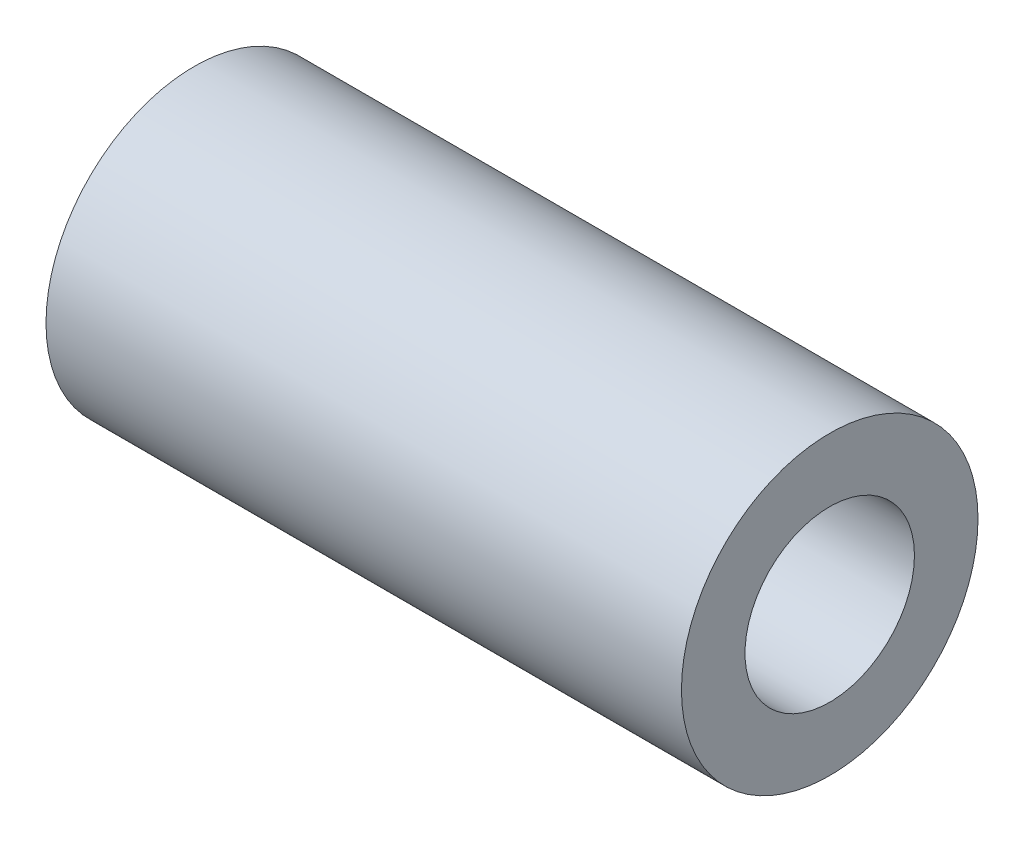
ISO-10303-21;
HEADER;
FILE_DESCRIPTION(('STEP AP214'),'2;1');
FILE_NAME('part.step','',(''),(''),'','','');
FILE_SCHEMA(('AUTOMOTIVE_DESIGN { 1 0 10303 214 1 1 1 1 }'));
ENDSEC;
DATA;
#1=APPLICATION_CONTEXT('core data for automotive mechanical design processes');
#2=APPLICATION_PROTOCOL_DEFINITION('international standard','automotive_design',2000,#1);
#3=PRODUCT_CONTEXT('',#1,'mechanical');
#4=PRODUCT('Part','Part','',(#3));
#5=PRODUCT_RELATED_PRODUCT_CATEGORY('part','',(#4));
#6=PRODUCT_DEFINITION_FORMATION('','',#4);
#7=PRODUCT_DEFINITION_CONTEXT('part definition',#1,'design');
#8=PRODUCT_DEFINITION('design','',#6,#7);
#9=PRODUCT_DEFINITION_SHAPE('','',#8);
#10=(LENGTH_UNIT() NAMED_UNIT(*) SI_UNIT(.MILLI.,.METRE.));
#11=(NAMED_UNIT(*) PLANE_ANGLE_UNIT() SI_UNIT($,.RADIAN.));
#12=(NAMED_UNIT(*) SI_UNIT($,.STERADIAN.) SOLID_ANGLE_UNIT());
#13=UNCERTAINTY_MEASURE_WITH_UNIT(LENGTH_MEASURE(1.E-05),#10,'distance_accuracy_value','');
#14=(GEOMETRIC_REPRESENTATION_CONTEXT(3) GLOBAL_UNCERTAINTY_ASSIGNED_CONTEXT((#13)) GLOBAL_UNIT_ASSIGNED_CONTEXT((#10,
#11,#12)) REPRESENTATION_CONTEXT('',''));
#15=CARTESIAN_POINT('',(0.,0.,0.));
#16=DIRECTION('',(0.,0.,1.));
#17=DIRECTION('',(1.,0.,0.));
#18=AXIS2_PLACEMENT_3D('',#15,#16,#17);
#19=CARTESIAN_POINT('',(7.5,0.,0.));
#20=DIRECTION('',(1.,0.,0.));
#21=DIRECTION('',(0.,0.,-1.));
#22=AXIS2_PLACEMENT_3D('',#19,#20,#21);
#23=PLANE('',#22);
#24=CARTESIAN_POINT('',(7.5,0.,0.));
#25=DIRECTION('',(1.,0.,0.));
#26=DIRECTION('',(0.,0.,-1.));
#27=AXIS2_PLACEMENT_3D('',#24,#25,#26);
#28=CIRCLE('',#27,3.5);
#29=CARTESIAN_POINT('',(7.5,0.,-3.5));
#30=VERTEX_POINT('',#29);
#31=EDGE_CURVE('E10',#30,#30,#28,.T.);
#32=ORIENTED_EDGE('',*,*,#31,.T.);
#33=EDGE_LOOP('',(#32));
#34=FACE_BOUND('',#33,.T.);
#35=CARTESIAN_POINT('',(7.5,0.,0.));
#36=DIRECTION('',(1.,0.,0.));
#37=DIRECTION('',(0.,0.,-1.));
#38=AXIS2_PLACEMENT_3D('',#35,#36,#37);
#39=CIRCLE('',#38,2.);
#40=CARTESIAN_POINT('',(7.5,0.,-2.));
#41=VERTEX_POINT('',#40);
#42=EDGE_CURVE('E44',#41,#41,#39,.T.);
#43=ORIENTED_EDGE('',*,*,#42,.F.);
#44=EDGE_LOOP('',(#43));
#45=FACE_BOUND('',#44,.T.);
#46=ADVANCED_FACE('F33',(#34,#45),#23,.T.);
#47=CARTESIAN_POINT('',(-7.5,0.,0.));
#48=DIRECTION('',(1.,0.,0.));
#49=DIRECTION('',(0.,0.,-1.));
#50=AXIS2_PLACEMENT_3D('',#47,#48,#49);
#51=PLANE('',#50);
#52=CARTESIAN_POINT('',(-7.5,0.,0.));
#53=DIRECTION('',(1.,0.,0.));
#54=DIRECTION('',(0.,0.,-1.));
#55=AXIS2_PLACEMENT_3D('',#52,#53,#54);
#56=CIRCLE('',#55,3.5);
#57=CARTESIAN_POINT('',(-7.5,0.,-3.5));
#58=VERTEX_POINT('',#57);
#59=EDGE_CURVE('E37',#58,#58,#56,.T.);
#60=ORIENTED_EDGE('',*,*,#59,.F.);
#61=EDGE_LOOP('',(#60));
#62=FACE_BOUND('',#61,.T.);
#63=CARTESIAN_POINT('',(-7.5,0.,0.));
#64=DIRECTION('',(1.,0.,0.));
#65=DIRECTION('',(0.,0.,-1.));
#66=AXIS2_PLACEMENT_3D('',#63,#64,#65);
#67=CIRCLE('',#66,2.);
#68=CARTESIAN_POINT('',(-7.5,0.,-2.));
#69=VERTEX_POINT('',#68);
#70=EDGE_CURVE('E46',#69,#69,#67,.T.);
#71=ORIENTED_EDGE('',*,*,#70,.T.);
#72=EDGE_LOOP('',(#71));
#73=FACE_BOUND('',#72,.T.);
#74=ADVANCED_FACE('F56',(#62,#73),#51,.F.);
#75=CARTESIAN_POINT('',(7.5,0.,0.));
#76=DIRECTION('',(-1.,0.,0.));
#77=DIRECTION('',(0.,0.,1.));
#78=AXIS2_PLACEMENT_3D('',#75,#76,#77);
#79=CYLINDRICAL_SURFACE('',#78,3.5);
#80=ORIENTED_EDGE('',*,*,#31,.F.);
#81=EDGE_LOOP('',(#80));
#82=FACE_BOUND('',#81,.T.);
#83=ORIENTED_EDGE('',*,*,#59,.T.);
#84=EDGE_LOOP('',(#83));
#85=FACE_BOUND('',#84,.T.);
#86=ADVANCED_FACE('F35',(#82,#85),#79,.T.);
#87=CARTESIAN_POINT('',(7.5,0.,0.));
#88=DIRECTION('',(-1.,0.,0.));
#89=DIRECTION('',(0.,0.,1.));
#90=AXIS2_PLACEMENT_3D('',#87,#88,#89);
#91=CYLINDRICAL_SURFACE('',#90,2.);
#92=ORIENTED_EDGE('',*,*,#42,.T.);
#93=EDGE_LOOP('',(#92));
#94=FACE_BOUND('',#93,.T.);
#95=ORIENTED_EDGE('',*,*,#70,.F.);
#96=EDGE_LOOP('',(#95));
#97=FACE_BOUND('',#96,.T.);
#98=ADVANCED_FACE('F52',(#94,#97),#91,.F.);
#99=CLOSED_SHELL('',(#46,#74,#86,#98));
#100=MANIFOLD_SOLID_BREP('B2',#99);
#101=ADVANCED_BREP_SHAPE_REPRESENTATION('',(#18,#100),#14);
#102=SHAPE_DEFINITION_REPRESENTATION(#9,#101);
ENDSEC;
END-ISO-10303-21;
